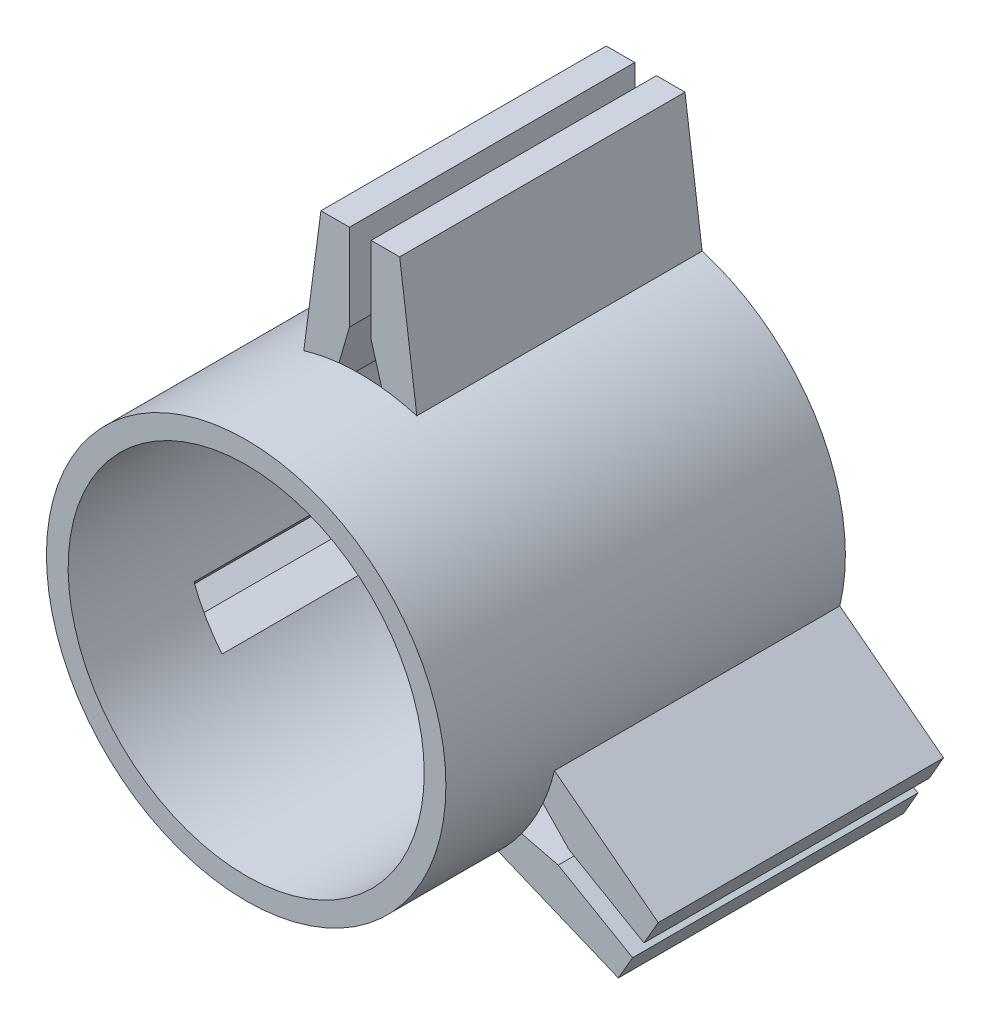
ISO-10303-21;
HEADER;
FILE_DESCRIPTION(('STEP AP214'),'2;1');
FILE_NAME('part.step','',(''),(''),'','','');
FILE_SCHEMA(('AUTOMOTIVE_DESIGN { 1 0 10303 214 1 1 1 1 }'));
ENDSEC;
DATA;
#1=APPLICATION_CONTEXT('core data for automotive mechanical design processes');
#2=APPLICATION_PROTOCOL_DEFINITION('international standard','automotive_design',2000,#1);
#3=PRODUCT_CONTEXT('',#1,'mechanical');
#4=PRODUCT('Part','Part','',(#3));
#5=PRODUCT_RELATED_PRODUCT_CATEGORY('part','',(#4));
#6=PRODUCT_DEFINITION_FORMATION('','',#4);
#7=PRODUCT_DEFINITION_CONTEXT('part definition',#1,'design');
#8=PRODUCT_DEFINITION('design','',#6,#7);
#9=PRODUCT_DEFINITION_SHAPE('','',#8);
#10=(LENGTH_UNIT() NAMED_UNIT(*) SI_UNIT(.MILLI.,.METRE.));
#11=(NAMED_UNIT(*) PLANE_ANGLE_UNIT() SI_UNIT($,.RADIAN.));
#12=(NAMED_UNIT(*) SI_UNIT($,.STERADIAN.) SOLID_ANGLE_UNIT());
#13=UNCERTAINTY_MEASURE_WITH_UNIT(LENGTH_MEASURE(1.E-05),#10,'distance_accuracy_value','');
#14=(GEOMETRIC_REPRESENTATION_CONTEXT(3) GLOBAL_UNCERTAINTY_ASSIGNED_CONTEXT((#13)) GLOBAL_UNIT_ASSIGNED_CONTEXT((#10,
#11,#12)) REPRESENTATION_CONTEXT('',''));
#15=CARTESIAN_POINT('',(0.,0.,0.));
#16=DIRECTION('',(0.,0.,1.));
#17=DIRECTION('',(1.,0.,0.));
#18=AXIS2_PLACEMENT_3D('',#15,#16,#17);
#19=CARTESIAN_POINT('',(0.,0.,25.4));
#20=DIRECTION('',(0.,0.,-1.));
#21=DIRECTION('',(-1.,0.,0.));
#22=AXIS2_PLACEMENT_3D('',#19,#20,#21);
#23=CYLINDRICAL_SURFACE('',#22,44.45);
#24=CARTESIAN_POINT('',(0.,0.,25.4));
#25=DIRECTION('',(0.,0.,1.));
#26=DIRECTION('',(1.,0.,0.));
#27=AXIS2_PLACEMENT_3D('',#24,#25,#26);
#28=CIRCLE('',#27,44.45);
#29=CARTESIAN_POINT('',(44.45,0.,25.4));
#30=VERTEX_POINT('',#29);
#31=EDGE_CURVE('E49',#30,#30,#28,.T.);
#32=ORIENTED_EDGE('',*,*,#31,.F.);
#33=EDGE_LOOP('',(#32));
#34=FACE_BOUND('',#33,.T.);
#35=CARTESIAN_POINT('',(0.,0.,-63.5));
#36=DIRECTION('',(0.,0.,-1.));
#37=DIRECTION('',(-1.,0.,0.));
#38=AXIS2_PLACEMENT_3D('',#35,#36,#37);
#39=CIRCLE('',#38,44.45);
#40=CARTESIAN_POINT('',(-43.2092792595573,-10.4288391429532,-63.5));
#41=VERTEX_POINT('',#40);
#42=CARTESIAN_POINT('',(-12.5730000000002,42.6347530894691,-63.5));
#43=VERTEX_POINT('',#42);
#44=EDGE_CURVE('E276',#41,#43,#39,.T.);
#45=ORIENTED_EDGE('',*,*,#44,.F.);
#46=DIRECTION('',(0.,0.,-1.));
#47=VECTOR('',#46,1.);
#48=CARTESIAN_POINT('',(-43.2092792595573,-10.4288391429532,0.));
#49=LINE('',#48,#47);
#50=CARTESIAN_POINT('',(-43.2092792595573,-10.4288391429532,0.));
#51=VERTEX_POINT('',#50);
#52=EDGE_CURVE('E262',#51,#41,#49,.T.);
#53=ORIENTED_EDGE('',*,*,#52,.F.);
#54=CARTESIAN_POINT('',(0.,0.,0.));
#55=DIRECTION('',(0.,0.,1.));
#56=DIRECTION('',(1.,0.,0.));
#57=AXIS2_PLACEMENT_3D('',#54,#55,#56);
#58=CIRCLE('',#57,44.45);
#59=CARTESIAN_POINT('',(-40.650438605974,-17.9817780306048,0.));
#60=VERTEX_POINT('',#59);
#61=EDGE_CURVE('E318',#51,#60,#58,.T.);
#62=ORIENTED_EDGE('',*,*,#61,.T.);
#63=CARTESIAN_POINT('',(-35.8978958827037,-26.2134234924507,0.));
#64=VERTEX_POINT('',#63);
#65=EDGE_CURVE('E324',#60,#64,#58,.T.);
#66=ORIENTED_EDGE('',*,*,#65,.T.);
#67=CARTESIAN_POINT('',(-30.6362792595571,-32.2059139465166,0.));
#68=VERTEX_POINT('',#67);
#69=EDGE_CURVE('E319',#64,#68,#58,.T.);
#70=ORIENTED_EDGE('',*,*,#69,.T.);
#71=DIRECTION('',(0.,0.,-1.));
#72=VECTOR('',#71,1.);
#73=CARTESIAN_POINT('',(-30.6362792595571,-32.2059139465166,0.));
#74=LINE('',#73,#72);
#75=CARTESIAN_POINT('',(-30.6362792595571,-32.2059139465166,-63.5));
#76=VERTEX_POINT('',#75);
#77=EDGE_CURVE('E264',#68,#76,#74,.T.);
#78=ORIENTED_EDGE('',*,*,#77,.T.);
#79=CARTESIAN_POINT('',(30.6362792595574,-32.2059139465163,-63.5));
#80=VERTEX_POINT('',#79);
#81=EDGE_CURVE('E371',#80,#76,#39,.T.);
#82=ORIENTED_EDGE('',*,*,#81,.F.);
#83=DIRECTION('',(0.,0.,-1.));
#84=VECTOR('',#83,1.);
#85=CARTESIAN_POINT('',(30.6362792595574,-32.2059139465163,0.));
#86=LINE('',#85,#84);
#87=CARTESIAN_POINT('',(30.6362792595574,-32.2059139465163,0.));
#88=VERTEX_POINT('',#87);
#89=EDGE_CURVE('E557',#88,#80,#86,.T.);
#90=ORIENTED_EDGE('',*,*,#89,.F.);
#91=CARTESIAN_POINT('',(35.8978958827036,-26.2134234924507,0.));
#92=VERTEX_POINT('',#91);
#93=EDGE_CURVE('E325',#88,#92,#58,.T.);
#94=ORIENTED_EDGE('',*,*,#93,.T.);
#95=CARTESIAN_POINT('',(40.6504386059739,-17.9817780306048,0.));
#96=VERTEX_POINT('',#95);
#97=EDGE_CURVE('E331',#92,#96,#58,.T.);
#98=ORIENTED_EDGE('',*,*,#97,.T.);
#99=CARTESIAN_POINT('',(43.2092792595574,-10.4288391429528,0.));
#100=VERTEX_POINT('',#99);
#101=EDGE_CURVE('E312',#96,#100,#58,.T.);
#102=ORIENTED_EDGE('',*,*,#101,.T.);
#103=DIRECTION('',(0.,0.,-1.));
#104=VECTOR('',#103,1.);
#105=CARTESIAN_POINT('',(43.2092792595574,-10.4288391429528,0.));
#106=LINE('',#105,#104);
#107=CARTESIAN_POINT('',(43.2092792595574,-10.4288391429528,-63.5));
#108=VERTEX_POINT('',#107);
#109=EDGE_CURVE('E501',#100,#108,#106,.T.);
#110=ORIENTED_EDGE('',*,*,#109,.T.);
#111=CARTESIAN_POINT('',(12.5729999999998,42.6347530894692,-63.5));
#112=VERTEX_POINT('',#111);
#113=EDGE_CURVE('E367',#112,#108,#39,.T.);
#114=ORIENTED_EDGE('',*,*,#113,.F.);
#115=DIRECTION('',(0.,0.,-1.));
#116=VECTOR('',#115,1.);
#117=CARTESIAN_POINT('',(12.5729999999998,42.6347530894692,0.));
#118=LINE('',#117,#116);
#119=CARTESIAN_POINT('',(12.5729999999998,42.6347530894692,0.));
#120=VERTEX_POINT('',#119);
#121=EDGE_CURVE('E610',#120,#112,#118,.T.);
#122=ORIENTED_EDGE('',*,*,#121,.F.);
#123=CARTESIAN_POINT('',(4.75254272327029,44.1952015230555,0.));
#124=VERTEX_POINT('',#123);
#125=EDGE_CURVE('E64',#120,#124,#58,.T.);
#126=ORIENTED_EDGE('',*,*,#125,.T.);
#127=CARTESIAN_POINT('',(-4.7525427232703,44.1952015230555,0.));
#128=VERTEX_POINT('',#127);
#129=EDGE_CURVE('E314',#124,#128,#58,.T.);
#130=ORIENTED_EDGE('',*,*,#129,.T.);
#131=CARTESIAN_POINT('',(-12.5730000000002,42.6347530894691,0.));
#132=VERTEX_POINT('',#131);
#133=EDGE_CURVE('E315',#128,#132,#58,.T.);
#134=ORIENTED_EDGE('',*,*,#133,.T.);
#135=DIRECTION('',(0.,0.,-1.));
#136=VECTOR('',#135,1.);
#137=CARTESIAN_POINT('',(-12.5730000000002,42.6347530894691,0.));
#138=LINE('',#137,#136);
#139=EDGE_CURVE('E561',#132,#43,#138,.T.);
#140=ORIENTED_EDGE('',*,*,#139,.T.);
#141=EDGE_LOOP('',(#45,#53,#62,#66,#70,#78,#82,#90,#94,#98,#102,#110,#114,#122,#126,#130,#134,#140));
#142=FACE_BOUND('',#141,.T.);
#143=ADVANCED_FACE('F42',(#34,#142),#23,.T.);
#144=CARTESIAN_POINT('',(0.,0.,-63.5));
#145=DIRECTION('',(0.,0.,-1.));
#146=DIRECTION('',(-1.,0.,0.));
#147=AXIS2_PLACEMENT_3D('',#144,#145,#146);
#148=PLANE('',#147);
#149=DIRECTION('',(0.13142147723,-0.99132658358519,0.));
#150=VECTOR('',#149,1.);
#151=CARTESIAN_POINT('',(8.76299999999971,71.3740000000001,-63.5));
#152=LINE('',#151,#150);
#153=CARTESIAN_POINT('',(8.763,71.374,-63.5));
#154=VERTEX_POINT('',#153);
#155=EDGE_CURVE('E615',#154,#112,#152,.T.);
#156=ORIENTED_EDGE('',*,*,#155,.T.);
#157=ORIENTED_EDGE('',*,*,#113,.T.);
#158=DIRECTION('',(0.793152507238292,-0.60902307038536,0.));
#159=VECTOR('',#158,1.);
#160=CARTESIAN_POINT('',(66.3031823959912,-28.161519386637,-63.5));
#161=LINE('',#160,#159);
#162=CARTESIAN_POINT('',(66.3031823959912,-28.161519386637,-63.5));
#163=VERTEX_POINT('',#162);
#164=EDGE_CURVE('E533',#108,#163,#161,.T.);
#165=ORIENTED_EDGE('',*,*,#164,.T.);
#166=DIRECTION('',(0.500000000000001,0.866025403784438,0.));
#167=VECTOR('',#166,1.);
#168=CARTESIAN_POINT('',(61.9216823959911,-35.7505000000001,-63.5));
#169=LINE('',#168,#167);
#170=CARTESIAN_POINT('',(63.1281823959911,-33.6607807006682,-63.5));
#171=VERTEX_POINT('',#170);
#172=EDGE_CURVE('E369',#171,#163,#169,.T.);
#173=ORIENTED_EDGE('',*,*,#172,.F.);
#174=DIRECTION('',(0.866025403784438,-0.500000000000001,0.));
#175=VECTOR('',#174,1.);
#176=CARTESIAN_POINT('',(1.2065,2.08971929933186,-63.5));
#177=LINE('',#176,#175);
#178=CARTESIAN_POINT('',(46.4567248521855,-24.0355101999686,-63.5));
#179=VERTEX_POINT('',#178);
#180=EDGE_CURVE('E373',#179,#171,#177,.T.);
#181=ORIENTED_EDGE('',*,*,#180,.F.);
#182=DIRECTION('',(0.692203152754547,-0.72170270563208,0.));
#183=VECTOR('',#182,1.);
#184=CARTESIAN_POINT('',(46.4567248521855,-24.0355101999686,-63.5));
#185=LINE('',#184,#183);
#186=CARTESIAN_POINT('',(37.001052007219,-14.1768658863332,-63.5));
#187=VERTEX_POINT('',#186);
#188=EDGE_CURVE('E361',#187,#179,#185,.T.);
#189=ORIENTED_EDGE('',*,*,#188,.F.);
#190=CARTESIAN_POINT('',(0.,0.,-63.5));
#191=DIRECTION('',(0.,0.,-1.));
#192=DIRECTION('',(-1.,0.,0.));
#193=AXIS2_PLACEMENT_3D('',#190,#191,#192);
#194=CIRCLE('',#193,39.624);
#195=CARTESIAN_POINT('',(6.223,39.1322839481674,-63.5));
#196=VERTEX_POINT('',#195);
#197=EDGE_CURVE('E398',#187,#196,#194,.F.);
#198=ORIENTED_EDGE('',*,*,#197,.T.);
#199=DIRECTION('',(0.27891130068007,-0.960316867681158,0.));
#200=VECTOR('',#199,1.);
#201=CARTESIAN_POINT('',(2.413,52.2504589986008,-63.5));
#202=LINE('',#201,#200);
#203=CARTESIAN_POINT('',(2.413,52.2504589986008,-63.5));
#204=VERTEX_POINT('',#203);
#205=EDGE_CURVE('E457',#204,#196,#202,.T.);
#206=ORIENTED_EDGE('',*,*,#205,.F.);
#207=DIRECTION('',(0.,1.,0.));
#208=VECTOR('',#207,1.);
#209=CARTESIAN_POINT('',(2.413,0.,-63.5));
#210=LINE('',#209,#208);
#211=CARTESIAN_POINT('',(2.413,71.374,-63.5));
#212=VERTEX_POINT('',#211);
#213=EDGE_CURVE('E391',#204,#212,#210,.T.);
#214=ORIENTED_EDGE('',*,*,#213,.T.);
#215=DIRECTION('',(1.,0.,0.));
#216=VECTOR('',#215,1.);
#217=CARTESIAN_POINT('',(0.,71.374,-63.5));
#218=LINE('',#217,#216);
#219=EDGE_CURVE('E393',#212,#154,#218,.T.);
#220=ORIENTED_EDGE('',*,*,#219,.T.);
#221=EDGE_LOOP('',(#156,#157,#165,#173,#181,#189,#198,#206,#214,#220));
#222=FACE_BOUND('',#221,.T.);
#223=ADVANCED_FACE('F515',(#222),#148,.T.);
#224=ORIENTED_EDGE('',*,*,#81,.T.);
#225=DIRECTION('',(-0.924005704063663,-0.38237868515101,0.));
#226=VECTOR('',#225,1.);
#227=CARTESIAN_POINT('',(-57.5401823959908,-43.3394806133636,-63.5));
#228=LINE('',#227,#226);
#229=CARTESIAN_POINT('',(-57.5401823959908,-43.3394806133636,-63.5));
#230=VERTEX_POINT('',#229);
#231=EDGE_CURVE('E607',#76,#230,#228,.T.);
#232=ORIENTED_EDGE('',*,*,#231,.T.);
#233=DIRECTION('',(0.5,-0.866025403784439,0.));
#234=VECTOR('',#233,1.);
#235=CARTESIAN_POINT('',(-61.9216823959912,-35.7505,-63.5));
#236=LINE('',#235,#234);
#237=CARTESIAN_POINT('',(-60.7151823959912,-37.8402192993318,-63.5));
#238=VERTEX_POINT('',#237);
#239=EDGE_CURVE('E380',#238,#230,#236,.T.);
#240=ORIENTED_EDGE('',*,*,#239,.F.);
#241=DIRECTION('',(-0.866025403784439,-0.5,0.));
#242=VECTOR('',#241,1.);
#243=CARTESIAN_POINT('',(1.2065,-2.08971929933186,-63.5));
#244=LINE('',#243,#242);
#245=CARTESIAN_POINT('',(-44.0437248521855,-28.2149487986322,-63.5));
#246=VERTEX_POINT('',#245);
#247=EDGE_CURVE('E383',#246,#238,#244,.T.);
#248=ORIENTED_EDGE('',*,*,#247,.F.);
#249=DIRECTION('',(-0.971114453434618,-0.238614162049078,0.));
#250=VECTOR('',#249,1.);
#251=CARTESIAN_POINT('',(-44.0437248521855,-28.2149487986322,-63.5));
#252=LINE('',#251,#250);
#253=CARTESIAN_POINT('',(-30.778052007219,-24.9554180618343,-63.5));
#254=VERTEX_POINT('',#253);
#255=EDGE_CURVE('E481',#254,#246,#252,.T.);
#256=ORIENTED_EDGE('',*,*,#255,.F.);
#257=CARTESIAN_POINT('',(30.778052007219,-24.9554180618343,-63.5));
#258=VERTEX_POINT('',#257);
#259=EDGE_CURVE('E399',#254,#258,#194,.F.);
#260=ORIENTED_EDGE('',*,*,#259,.T.);
#261=DIRECTION('',(-0.971114453434618,0.238614162049079,0.));
#262=VECTOR('',#261,1.);
#263=CARTESIAN_POINT('',(44.0437248521855,-28.2149487986323,-63.5));
#264=LINE('',#263,#262);
#265=CARTESIAN_POINT('',(44.0437248521855,-28.2149487986323,-63.5));
#266=VERTEX_POINT('',#265);
#267=EDGE_CURVE('E362',#266,#258,#264,.T.);
#268=ORIENTED_EDGE('',*,*,#267,.F.);
#269=DIRECTION('',(0.866025403784438,-0.5,0.));
#270=VECTOR('',#269,1.);
#271=CARTESIAN_POINT('',(-1.2065,-2.08971929933185,-63.5));
#272=LINE('',#271,#270);
#273=CARTESIAN_POINT('',(60.6051971697105,-37.7767192993319,-63.5));
#274=VERTEX_POINT('',#273);
#275=EDGE_CURVE('E375',#266,#274,#272,.T.);
#276=ORIENTED_EDGE('',*,*,#275,.T.);
#277=DIRECTION('',(-0.5,-0.866025403784438,0.));
#278=VECTOR('',#277,1.);
#279=CARTESIAN_POINT('',(61.8116971697105,-35.687,-63.5));
#280=LINE('',#279,#278);
#281=CARTESIAN_POINT('',(57.4301971697105,-43.2759806133631,-63.5));
#282=VERTEX_POINT('',#281);
#283=EDGE_CURVE('E377',#274,#282,#280,.T.);
#284=ORIENTED_EDGE('',*,*,#283,.T.);
#285=DIRECTION('',(-0.924224743446611,0.381848953908541,0.));
#286=VECTOR('',#285,1.);
#287=CARTESIAN_POINT('',(57.4301971697105,-43.2759806133631,-63.5));
#288=LINE('',#287,#286);
#289=EDGE_CURVE('E536',#282,#80,#288,.T.);
#290=ORIENTED_EDGE('',*,*,#289,.T.);
#291=EDGE_LOOP('',(#224,#232,#240,#248,#256,#260,#268,#276,#284,#290));
#292=FACE_BOUND('',#291,.T.);
#293=ADVANCED_FACE('F581',(#292),#148,.T.);
#294=CARTESIAN_POINT('',(0.,0.,25.4));
#295=DIRECTION('',(0.,0.,1.));
#296=DIRECTION('',(1.,0.,0.));
#297=AXIS2_PLACEMENT_3D('',#294,#295,#296);
#298=PLANE('',#297);
#299=ORIENTED_EDGE('',*,*,#31,.T.);
#300=EDGE_LOOP('',(#299));
#301=FACE_BOUND('',#300,.T.);
#302=CARTESIAN_POINT('',(0.,0.,25.4));
#303=DIRECTION('',(0.,0.,1.));
#304=DIRECTION('',(1.,0.,0.));
#305=AXIS2_PLACEMENT_3D('',#302,#303,#304);
#306=CIRCLE('',#305,39.624);
#307=CARTESIAN_POINT('',(39.624,0.,25.4));
#308=VERTEX_POINT('',#307);
#309=EDGE_CURVE('E309',#308,#308,#306,.T.);
#310=ORIENTED_EDGE('',*,*,#309,.F.);
#311=EDGE_LOOP('',(#310));
#312=FACE_BOUND('',#311,.T.);
#313=ADVANCED_FACE('F651',(#301,#312),#298,.T.);
#314=CARTESIAN_POINT('',(0.,0.,25.4));
#315=DIRECTION('',(0.,0.,-1.));
#316=DIRECTION('',(-1.,0.,0.));
#317=AXIS2_PLACEMENT_3D('',#314,#315,#316);
#318=CYLINDRICAL_SURFACE('',#317,39.624);
#319=DIRECTION('',(0.,0.,-1.));
#320=VECTOR('',#319,1.);
#321=CARTESIAN_POINT('',(6.223,39.1322839481674,0.));
#322=LINE('',#321,#320);
#323=CARTESIAN_POINT('',(6.223,39.1322839481674,0.));
#324=VERTEX_POINT('',#323);
#325=EDGE_CURVE('E451',#324,#196,#322,.T.);
#326=ORIENTED_EDGE('',*,*,#325,.T.);
#327=ORIENTED_EDGE('',*,*,#197,.F.);
#328=DIRECTION('',(0.,0.,-1.));
#329=VECTOR('',#328,1.);
#330=CARTESIAN_POINT('',(37.001052007219,-14.1768658863332,0.));
#331=LINE('',#330,#329);
#332=CARTESIAN_POINT('',(37.001052007219,-14.1768658863332,0.));
#333=VERTEX_POINT('',#332);
#334=EDGE_CURVE('E497',#333,#187,#331,.T.);
#335=ORIENTED_EDGE('',*,*,#334,.F.);
#336=CARTESIAN_POINT('',(0.,0.,0.));
#337=DIRECTION('',(0.,0.,1.));
#338=DIRECTION('',(-1.,0.,0.));
#339=AXIS2_PLACEMENT_3D('',#336,#337,#338);
#340=CIRCLE('',#339,39.624);
#341=CARTESIAN_POINT('',(30.778052007219,-24.9554180618343,0.));
#342=VERTEX_POINT('',#341);
#343=EDGE_CURVE('E353',#342,#333,#340,.T.);
#344=ORIENTED_EDGE('',*,*,#343,.F.);
#345=DIRECTION('',(0.,0.,-1.));
#346=VECTOR('',#345,1.);
#347=CARTESIAN_POINT('',(30.778052007219,-24.9554180618343,0.));
#348=LINE('',#347,#346);
#349=EDGE_CURVE('E351',#342,#258,#348,.T.);
#350=ORIENTED_EDGE('',*,*,#349,.T.);
#351=ORIENTED_EDGE('',*,*,#259,.F.);
#352=DIRECTION('',(0.,0.,-1.));
#353=VECTOR('',#352,1.);
#354=CARTESIAN_POINT('',(-30.778052007219,-24.9554180618343,0.));
#355=LINE('',#354,#353);
#356=CARTESIAN_POINT('',(-30.778052007219,-24.9554180618343,0.));
#357=VERTEX_POINT('',#356);
#358=EDGE_CURVE('E476',#357,#254,#355,.T.);
#359=ORIENTED_EDGE('',*,*,#358,.F.);
#360=CARTESIAN_POINT('',(0.,0.,0.));
#361=DIRECTION('',(0.,0.,1.));
#362=DIRECTION('',(-1.,0.,0.));
#363=AXIS2_PLACEMENT_3D('',#360,#361,#362);
#364=CIRCLE('',#363,39.624);
#365=CARTESIAN_POINT('',(-37.001052007219,-14.1768658863331,0.));
#366=VERTEX_POINT('',#365);
#367=EDGE_CURVE('E488',#366,#357,#364,.T.);
#368=ORIENTED_EDGE('',*,*,#367,.F.);
#369=DIRECTION('',(0.,0.,-1.));
#370=VECTOR('',#369,1.);
#371=CARTESIAN_POINT('',(-37.001052007219,-14.1768658863331,0.));
#372=LINE('',#371,#370);
#373=CARTESIAN_POINT('',(-37.001052007219,-14.1768658863331,-63.5));
#374=VERTEX_POINT('',#373);
#375=EDGE_CURVE('E473',#366,#374,#372,.T.);
#376=ORIENTED_EDGE('',*,*,#375,.T.);
#377=CARTESIAN_POINT('',(-6.223,39.1322839481674,-63.5));
#378=VERTEX_POINT('',#377);
#379=EDGE_CURVE('E395',#378,#374,#194,.F.);
#380=ORIENTED_EDGE('',*,*,#379,.F.);
#381=DIRECTION('',(0.,0.,-1.));
#382=VECTOR('',#381,1.);
#383=CARTESIAN_POINT('',(-6.223,39.1322839481674,0.));
#384=LINE('',#383,#382);
#385=CARTESIAN_POINT('',(-6.223,39.1322839481674,0.));
#386=VERTEX_POINT('',#385);
#387=EDGE_CURVE('E466',#386,#378,#384,.T.);
#388=ORIENTED_EDGE('',*,*,#387,.F.);
#389=CARTESIAN_POINT('',(0.,0.,0.));
#390=DIRECTION('',(0.,0.,1.));
#391=DIRECTION('',(-1.,0.,0.));
#392=AXIS2_PLACEMENT_3D('',#389,#390,#391);
#393=CIRCLE('',#392,39.624);
#394=EDGE_CURVE('E449',#324,#386,#393,.T.);
#395=ORIENTED_EDGE('',*,*,#394,.F.);
#396=EDGE_LOOP('',(#326,#327,#335,#344,#350,#351,#359,#368,#376,#380,#388,#395));
#397=FACE_BOUND('',#396,.T.);
#398=ORIENTED_EDGE('',*,*,#309,.T.);
#399=EDGE_LOOP('',(#398));
#400=FACE_BOUND('',#399,.T.);
#401=ADVANCED_FACE('F506',(#397,#400),#318,.F.);
#402=CARTESIAN_POINT('',(0.,0.,0.));
#403=DIRECTION('',(0.,0.,-1.));
#404=DIRECTION('',(-1.,0.,0.));
#405=AXIS2_PLACEMENT_3D('',#402,#403,#404);
#406=PLANE('',#405);
#407=DIRECTION('',(0.,1.,0.));
#408=VECTOR('',#407,1.);
#409=CARTESIAN_POINT('',(2.413,0.,0.));
#410=LINE('',#409,#408);
#411=CARTESIAN_POINT('',(2.413,52.2504589986008,0.));
#412=VERTEX_POINT('',#411);
#413=CARTESIAN_POINT('',(2.413,71.374,0.));
#414=VERTEX_POINT('',#413);
#415=EDGE_CURVE('E421',#412,#414,#410,.T.);
#416=ORIENTED_EDGE('',*,*,#415,.F.);
#417=DIRECTION('',(0.27891130068007,-0.960316867681158,0.));
#418=VECTOR('',#417,1.);
#419=CARTESIAN_POINT('',(2.413,52.2504589986008,0.));
#420=LINE('',#419,#418);
#421=EDGE_CURVE('E453',#412,#124,#420,.T.);
#422=ORIENTED_EDGE('',*,*,#421,.T.);
#423=ORIENTED_EDGE('',*,*,#125,.F.);
#424=DIRECTION('',(0.13142147723,-0.99132658358519,0.));
#425=VECTOR('',#424,1.);
#426=CARTESIAN_POINT('',(8.76299999999971,71.3740000000001,0.));
#427=LINE('',#426,#425);
#428=CARTESIAN_POINT('',(8.76299999999971,71.3740000000001,0.));
#429=VERTEX_POINT('',#428);
#430=EDGE_CURVE('E614',#429,#120,#427,.T.);
#431=ORIENTED_EDGE('',*,*,#430,.F.);
#432=DIRECTION('',(1.,0.,0.));
#433=VECTOR('',#432,1.);
#434=CARTESIAN_POINT('',(0.,71.374,0.));
#435=LINE('',#434,#433);
#436=EDGE_CURVE('E370',#414,#429,#435,.T.);
#437=ORIENTED_EDGE('',*,*,#436,.F.);
#438=EDGE_LOOP('',(#416,#422,#423,#431,#437));
#439=FACE_BOUND('',#438,.T.);
#440=ADVANCED_FACE('F622',(#439),#406,.F.);
#441=ORIENTED_EDGE('',*,*,#133,.F.);
#442=DIRECTION('',(0.27891130068007,0.960316867681158,0.));
#443=VECTOR('',#442,1.);
#444=CARTESIAN_POINT('',(-2.413,52.2504589986008,0.));
#445=LINE('',#444,#443);
#446=CARTESIAN_POINT('',(-2.413,52.2504589986008,0.));
#447=VERTEX_POINT('',#446);
#448=EDGE_CURVE('E445',#128,#447,#445,.T.);
#449=ORIENTED_EDGE('',*,*,#448,.T.);
#450=DIRECTION('',(0.,1.,0.));
#451=VECTOR('',#450,1.);
#452=CARTESIAN_POINT('',(-2.413,0.,0.));
#453=LINE('',#452,#451);
#454=CARTESIAN_POINT('',(-2.413,71.501,0.));
#455=VERTEX_POINT('',#454);
#456=EDGE_CURVE('E419',#447,#455,#453,.T.);
#457=ORIENTED_EDGE('',*,*,#456,.T.);
#458=DIRECTION('',(-1.,0.,0.));
#459=VECTOR('',#458,1.);
#460=CARTESIAN_POINT('',(0.,71.501,0.));
#461=LINE('',#460,#459);
#462=CARTESIAN_POINT('',(-8.76300000000031,71.501,0.));
#463=VERTEX_POINT('',#462);
#464=EDGE_CURVE('E416',#455,#463,#461,.T.);
#465=ORIENTED_EDGE('',*,*,#464,.T.);
#466=DIRECTION('',(0.13085319682537,0.991401755536362,0.));
#467=VECTOR('',#466,1.);
#468=CARTESIAN_POINT('',(-8.76300000000031,71.501,0.));
#469=LINE('',#468,#467);
#470=EDGE_CURVE('E443',#132,#463,#469,.T.);
#471=ORIENTED_EDGE('',*,*,#470,.F.);
#472=EDGE_LOOP('',(#441,#449,#457,#465,#471));
#473=FACE_BOUND('',#472,.T.);
#474=ADVANCED_FACE('F442',(#473),#406,.F.);
#475=DIRECTION('',(-0.866025403784439,-0.5,0.));
#476=VECTOR('',#475,1.);
#477=CARTESIAN_POINT('',(-1.2065,2.08971929933185,0.));
#478=LINE('',#477,#476);
#479=CARTESIAN_POINT('',(-46.4567248521855,-24.0355101999685,0.));
#480=VERTEX_POINT('',#479);
#481=CARTESIAN_POINT('',(-63.0181971697105,-33.5972807006681,0.));
#482=VERTEX_POINT('',#481);
#483=EDGE_CURVE('E413',#480,#482,#478,.T.);
#484=ORIENTED_EDGE('',*,*,#483,.F.);
#485=DIRECTION('',(0.692203152754548,0.72170270563208,0.));
#486=VECTOR('',#485,1.);
#487=CARTESIAN_POINT('',(-46.4567248521855,-24.0355101999685,0.));
#488=LINE('',#487,#486);
#489=EDGE_CURVE('E483',#480,#60,#488,.T.);
#490=ORIENTED_EDGE('',*,*,#489,.T.);
#491=ORIENTED_EDGE('',*,*,#61,.F.);
#492=DIRECTION('',(0.792803266216609,0.609477629676657,0.));
#493=VECTOR('',#492,1.);
#494=CARTESIAN_POINT('',(-66.1931971697103,-28.0980193866375,0.));
#495=LINE('',#494,#493);
#496=CARTESIAN_POINT('',(-66.1931971697103,-28.0980193866375,0.));
#497=VERTEX_POINT('',#496);
#498=EDGE_CURVE('E265',#497,#51,#495,.T.);
#499=ORIENTED_EDGE('',*,*,#498,.F.);
#500=DIRECTION('',(-0.5,0.866025403784439,0.));
#501=VECTOR('',#500,1.);
#502=CARTESIAN_POINT('',(-61.8116971697105,-35.687,0.));
#503=LINE('',#502,#501);
#504=EDGE_CURVE('E281',#482,#497,#503,.T.);
#505=ORIENTED_EDGE('',*,*,#504,.F.);
#506=EDGE_LOOP('',(#484,#490,#491,#499,#505));
#507=FACE_BOUND('',#506,.T.);
#508=ADVANCED_FACE('F601',(#507),#406,.F.);
#509=ORIENTED_EDGE('',*,*,#69,.F.);
#510=DIRECTION('',(-0.971114453434618,-0.238614162049078,0.));
#511=VECTOR('',#510,1.);
#512=CARTESIAN_POINT('',(-44.0437248521855,-28.2149487986322,0.));
#513=LINE('',#512,#511);
#514=CARTESIAN_POINT('',(-44.0437248521855,-28.2149487986322,0.));
#515=VERTEX_POINT('',#514);
#516=EDGE_CURVE('E472',#64,#515,#513,.T.);
#517=ORIENTED_EDGE('',*,*,#516,.T.);
#518=DIRECTION('',(-0.866025403784439,-0.5,0.));
#519=VECTOR('',#518,1.);
#520=CARTESIAN_POINT('',(1.2065,-2.08971929933186,0.));
#521=LINE('',#520,#519);
#522=CARTESIAN_POINT('',(-60.7151823959912,-37.8402192993318,0.));
#523=VERTEX_POINT('',#522);
#524=EDGE_CURVE('E411',#515,#523,#521,.T.);
#525=ORIENTED_EDGE('',*,*,#524,.T.);
#526=DIRECTION('',(0.5,-0.866025403784439,0.));
#527=VECTOR('',#526,1.);
#528=CARTESIAN_POINT('',(-61.9216823959912,-35.7505,0.));
#529=LINE('',#528,#527);
#530=CARTESIAN_POINT('',(-57.5401823959912,-43.339480613363,0.));
#531=VERTEX_POINT('',#530);
#532=EDGE_CURVE('E408',#523,#531,#529,.T.);
#533=ORIENTED_EDGE('',*,*,#532,.T.);
#534=DIRECTION('',(-0.924005704063663,-0.38237868515101,0.));
#535=VECTOR('',#534,1.);
#536=CARTESIAN_POINT('',(-57.5401823959908,-43.3394806133636,0.));
#537=LINE('',#536,#535);
#538=EDGE_CURVE('E606',#68,#531,#537,.T.);
#539=ORIENTED_EDGE('',*,*,#538,.F.);
#540=EDGE_LOOP('',(#509,#517,#525,#533,#539));
#541=FACE_BOUND('',#540,.T.);
#542=ADVANCED_FACE('F764',(#541),#406,.F.);
#543=DIRECTION('',(0.866025403784438,-0.5,0.));
#544=VECTOR('',#543,1.);
#545=CARTESIAN_POINT('',(-1.2065,-2.08971929933185,0.));
#546=LINE('',#545,#544);
#547=CARTESIAN_POINT('',(44.0437248521855,-28.2149487986323,0.));
#548=VERTEX_POINT('',#547);
#549=CARTESIAN_POINT('',(60.6051971697105,-37.7767192993319,0.));
#550=VERTEX_POINT('',#549);
#551=EDGE_CURVE('E360',#548,#550,#546,.T.);
#552=ORIENTED_EDGE('',*,*,#551,.F.);
#553=DIRECTION('',(-0.971114453434618,0.238614162049079,0.));
#554=VECTOR('',#553,1.);
#555=CARTESIAN_POINT('',(44.0437248521855,-28.2149487986323,0.));
#556=LINE('',#555,#554);
#557=EDGE_CURVE('E348',#548,#92,#556,.T.);
#558=ORIENTED_EDGE('',*,*,#557,.T.);
#559=ORIENTED_EDGE('',*,*,#93,.F.);
#560=DIRECTION('',(-0.924224743446611,0.381848953908541,0.));
#561=VECTOR('',#560,1.);
#562=CARTESIAN_POINT('',(57.4301971697105,-43.2759806133631,0.));
#563=LINE('',#562,#561);
#564=CARTESIAN_POINT('',(57.4301971697105,-43.2759806133631,0.));
#565=VERTEX_POINT('',#564);
#566=EDGE_CURVE('E539',#565,#88,#563,.T.);
#567=ORIENTED_EDGE('',*,*,#566,.F.);
#568=DIRECTION('',(-0.5,-0.866025403784438,0.));
#569=VECTOR('',#568,1.);
#570=CARTESIAN_POINT('',(61.8116971697105,-35.687,0.));
#571=LINE('',#570,#569);
#572=EDGE_CURVE('E406',#550,#565,#571,.T.);
#573=ORIENTED_EDGE('',*,*,#572,.F.);
#574=EDGE_LOOP('',(#552,#558,#559,#567,#573));
#575=FACE_BOUND('',#574,.T.);
#576=ADVANCED_FACE('F357',(#575),#406,.F.);
#577=CARTESIAN_POINT('',(61.9216823959911,-35.7505000000001,-63.5));
#578=DIRECTION('',(0.866025403784438,-0.500000000000001,0.));
#579=DIRECTION('',(0.500000000000001,0.866025403784438,0.));
#580=AXIS2_PLACEMENT_3D('',#577,#578,#579);
#581=PLANE('',#580);
#582=DIRECTION('',(0.500000000000001,0.866025403784438,0.));
#583=VECTOR('',#582,1.);
#584=CARTESIAN_POINT('',(61.9216823959911,-35.7505000000001,0.));
#585=LINE('',#584,#583);
#586=CARTESIAN_POINT('',(63.1281823959911,-33.6607807006682,0.));
#587=VERTEX_POINT('',#586);
#588=CARTESIAN_POINT('',(66.3031823959912,-28.161519386637,0.));
#589=VERTEX_POINT('',#588);
#590=EDGE_CURVE('E400',#587,#589,#585,.T.);
#591=ORIENTED_EDGE('',*,*,#590,.F.);
#592=DIRECTION('',(0.,0.,1.));
#593=VECTOR('',#592,1.);
#594=CARTESIAN_POINT('',(63.1281823959911,-33.6607807006682,-63.5));
#595=LINE('',#594,#593);
#596=EDGE_CURVE('E303',#171,#587,#595,.T.);
#597=ORIENTED_EDGE('',*,*,#596,.F.);
#598=ORIENTED_EDGE('',*,*,#172,.T.);
#599=DIRECTION('',(0.,0.,1.));
#600=VECTOR('',#599,1.);
#601=CARTESIAN_POINT('',(66.3031823959912,-28.161519386637,-63.5));
#602=LINE('',#601,#600);
#603=EDGE_CURVE('E306',#163,#589,#602,.T.);
#604=ORIENTED_EDGE('',*,*,#603,.T.);
#605=EDGE_LOOP('',(#591,#597,#598,#604));
#606=FACE_BOUND('',#605,.T.);
#607=ADVANCED_FACE('F525',(#606),#581,.T.);
#608=CARTESIAN_POINT('',(1.2065,2.08971929933186,-63.5));
#609=DIRECTION('',(-0.500000000000001,-0.866025403784438,0.));
#610=DIRECTION('',(0.866025403784438,-0.500000000000001,0.));
#611=AXIS2_PLACEMENT_3D('',#608,#609,#610);
#612=PLANE('',#611);
#613=DIRECTION('',(0.,0.,-1.));
#614=VECTOR('',#613,1.);
#615=CARTESIAN_POINT('',(46.4567248521855,-24.0355101999686,0.));
#616=LINE('',#615,#614);
#617=CARTESIAN_POINT('',(46.4567248521854,-24.0355101999685,0.));
#618=VERTEX_POINT('',#617);
#619=EDGE_CURVE('E499',#618,#179,#616,.T.);
#620=ORIENTED_EDGE('',*,*,#619,.T.);
#621=ORIENTED_EDGE('',*,*,#180,.T.);
#622=ORIENTED_EDGE('',*,*,#596,.T.);
#623=DIRECTION('',(0.866025403784438,-0.500000000000001,0.));
#624=VECTOR('',#623,1.);
#625=CARTESIAN_POINT('',(1.2065,2.08971929933186,0.));
#626=LINE('',#625,#624);
#627=EDGE_CURVE('E402',#618,#587,#626,.T.);
#628=ORIENTED_EDGE('',*,*,#627,.F.);
#629=EDGE_LOOP('',(#620,#621,#622,#628));
#630=FACE_BOUND('',#629,.T.);
#631=ADVANCED_FACE('F521',(#630),#612,.T.);
#632=CARTESIAN_POINT('',(-1.2065,-2.08971929933185,-63.5));
#633=DIRECTION('',(-0.5,-0.866025403784438,0.));
#634=DIRECTION('',(0.866025403784438,-0.5,0.));
#635=AXIS2_PLACEMENT_3D('',#632,#633,#634);
#636=PLANE('',#635);
#637=ORIENTED_EDGE('',*,*,#275,.F.);
#638=DIRECTION('',(0.,0.,-1.));
#639=VECTOR('',#638,1.);
#640=CARTESIAN_POINT('',(44.0437248521855,-28.2149487986323,0.));
#641=LINE('',#640,#639);
#642=EDGE_CURVE('E494',#548,#266,#641,.T.);
#643=ORIENTED_EDGE('',*,*,#642,.F.);
#644=ORIENTED_EDGE('',*,*,#551,.T.);
#645=DIRECTION('',(0.,0.,1.));
#646=VECTOR('',#645,1.);
#647=CARTESIAN_POINT('',(60.6051971697105,-37.7767192993319,-63.5));
#648=LINE('',#647,#646);
#649=EDGE_CURVE('E300',#274,#550,#648,.T.);
#650=ORIENTED_EDGE('',*,*,#649,.F.);
#651=EDGE_LOOP('',(#637,#643,#644,#650));
#652=FACE_BOUND('',#651,.T.);
#653=ADVANCED_FACE('F578',(#652),#636,.F.);
#654=CARTESIAN_POINT('',(61.8116971697105,-35.687,-63.5));
#655=DIRECTION('',(-0.866025403784438,0.5,0.));
#656=DIRECTION('',(-0.5,-0.866025403784438,0.));
#657=AXIS2_PLACEMENT_3D('',#654,#655,#656);
#658=PLANE('',#657);
#659=ORIENTED_EDGE('',*,*,#572,.T.);
#660=DIRECTION('',(0.,0.,1.));
#661=VECTOR('',#660,1.);
#662=CARTESIAN_POINT('',(57.4301971697105,-43.2759806133631,-63.5));
#663=LINE('',#662,#661);
#664=EDGE_CURVE('E297',#282,#565,#663,.T.);
#665=ORIENTED_EDGE('',*,*,#664,.F.);
#666=ORIENTED_EDGE('',*,*,#283,.F.);
#667=ORIENTED_EDGE('',*,*,#649,.T.);
#668=EDGE_LOOP('',(#659,#665,#666,#667));
#669=FACE_BOUND('',#668,.T.);
#670=ADVANCED_FACE('F573',(#669),#658,.F.);
#671=CARTESIAN_POINT('',(-61.9216823959912,-35.7505,-63.5));
#672=DIRECTION('',(-0.866025403784439,-0.499999999999999,0.));
#673=DIRECTION('',(0.5,-0.866025403784439,0.));
#674=AXIS2_PLACEMENT_3D('',#671,#672,#673);
#675=PLANE('',#674);
#676=ORIENTED_EDGE('',*,*,#532,.F.);
#677=DIRECTION('',(0.,0.,1.));
#678=VECTOR('',#677,1.);
#679=CARTESIAN_POINT('',(-60.7151823959912,-37.8402192993318,-63.5));
#680=LINE('',#679,#678);
#681=EDGE_CURVE('E285',#238,#523,#680,.T.);
#682=ORIENTED_EDGE('',*,*,#681,.F.);
#683=ORIENTED_EDGE('',*,*,#239,.T.);
#684=DIRECTION('',(0.,0.,1.));
#685=VECTOR('',#684,1.);
#686=CARTESIAN_POINT('',(-57.5401823959912,-43.339480613363,-63.5));
#687=LINE('',#686,#685);
#688=EDGE_CURVE('E294',#230,#531,#687,.T.);
#689=ORIENTED_EDGE('',*,*,#688,.T.);
#690=EDGE_LOOP('',(#676,#682,#683,#689));
#691=FACE_BOUND('',#690,.T.);
#692=ADVANCED_FACE('F670',(#691),#675,.T.);
#693=CARTESIAN_POINT('',(1.2065,-2.08971929933186,-63.5));
#694=DIRECTION('',(-0.5,0.866025403784439,0.));
#695=DIRECTION('',(-0.866025403784439,-0.5,0.));
#696=AXIS2_PLACEMENT_3D('',#693,#694,#695);
#697=PLANE('',#696);
#698=DIRECTION('',(0.,0.,-1.));
#699=VECTOR('',#698,1.);
#700=CARTESIAN_POINT('',(-44.0437248521855,-28.2149487986322,0.));
#701=LINE('',#700,#699);
#702=EDGE_CURVE('E478',#515,#246,#701,.T.);
#703=ORIENTED_EDGE('',*,*,#702,.T.);
#704=ORIENTED_EDGE('',*,*,#247,.T.);
#705=ORIENTED_EDGE('',*,*,#681,.T.);
#706=ORIENTED_EDGE('',*,*,#524,.F.);
#707=EDGE_LOOP('',(#703,#704,#705,#706));
#708=FACE_BOUND('',#707,.T.);
#709=ADVANCED_FACE('F673',(#708),#697,.T.);
#710=CARTESIAN_POINT('',(-1.2065,2.08971929933185,-63.5));
#711=DIRECTION('',(-0.5,0.866025403784439,0.));
#712=DIRECTION('',(-0.866025403784439,-0.5,0.));
#713=AXIS2_PLACEMENT_3D('',#710,#711,#712);
#714=PLANE('',#713);
#715=DIRECTION('',(-0.866025403784439,-0.5,0.));
#716=VECTOR('',#715,1.);
#717=CARTESIAN_POINT('',(-1.2065,2.08971929933185,-63.5));
#718=LINE('',#717,#716);
#719=CARTESIAN_POINT('',(-46.4567248521855,-24.0355101999685,-63.5));
#720=VERTEX_POINT('',#719);
#721=CARTESIAN_POINT('',(-63.0181971697105,-33.5972807006681,-63.5));
#722=VERTEX_POINT('',#721);
#723=EDGE_CURVE('E272',#720,#722,#718,.T.);
#724=ORIENTED_EDGE('',*,*,#723,.F.);
#725=DIRECTION('',(0.,0.,-1.));
#726=VECTOR('',#725,1.);
#727=CARTESIAN_POINT('',(-46.4567248521855,-24.0355101999685,0.));
#728=LINE('',#727,#726);
#729=EDGE_CURVE('E470',#480,#720,#728,.T.);
#730=ORIENTED_EDGE('',*,*,#729,.F.);
#731=ORIENTED_EDGE('',*,*,#483,.T.);
#732=DIRECTION('',(0.,0.,1.));
#733=VECTOR('',#732,1.);
#734=CARTESIAN_POINT('',(-63.0181971697105,-33.5972807006681,-63.5));
#735=LINE('',#734,#733);
#736=EDGE_CURVE('E282',#722,#482,#735,.T.);
#737=ORIENTED_EDGE('',*,*,#736,.F.);
#738=EDGE_LOOP('',(#724,#730,#731,#737));
#739=FACE_BOUND('',#738,.T.);
#740=ADVANCED_FACE('F598',(#739),#714,.F.);
#741=CARTESIAN_POINT('',(-61.8116971697105,-35.687,-63.5));
#742=DIRECTION('',(0.866025403784439,0.499999999999999,0.));
#743=DIRECTION('',(-0.5,0.866025403784439,0.));
#744=AXIS2_PLACEMENT_3D('',#741,#742,#743);
#745=PLANE('',#744);
#746=ORIENTED_EDGE('',*,*,#504,.T.);
#747=DIRECTION('',(0.,0.,1.));
#748=VECTOR('',#747,1.);
#749=CARTESIAN_POINT('',(-66.1931971697105,-28.0980193866369,-63.5));
#750=LINE('',#749,#748);
#751=CARTESIAN_POINT('',(-66.1931971697103,-28.0980193866375,-63.5));
#752=VERTEX_POINT('',#751);
#753=EDGE_CURVE('E259',#752,#497,#750,.T.);
#754=ORIENTED_EDGE('',*,*,#753,.F.);
#755=DIRECTION('',(-0.5,0.866025403784439,0.));
#756=VECTOR('',#755,1.);
#757=CARTESIAN_POINT('',(-61.8116971697105,-35.687,-63.5));
#758=LINE('',#757,#756);
#759=EDGE_CURVE('E268',#722,#752,#758,.T.);
#760=ORIENTED_EDGE('',*,*,#759,.F.);
#761=ORIENTED_EDGE('',*,*,#736,.T.);
#762=EDGE_LOOP('',(#746,#754,#760,#761));
#763=FACE_BOUND('',#762,.T.);
#764=ADVANCED_FACE('F279',(#763),#745,.F.);
#765=CARTESIAN_POINT('',(0.,71.501,-63.5));
#766=DIRECTION('',(0.,1.,0.));
#767=DIRECTION('',(0.,0.,1.));
#768=AXIS2_PLACEMENT_3D('',#765,#766,#767);
#769=PLANE('',#768);
#770=ORIENTED_EDGE('',*,*,#464,.F.);
#771=DIRECTION('',(0.,0.,1.));
#772=VECTOR('',#771,1.);
#773=CARTESIAN_POINT('',(-2.413,71.501,-63.5));
#774=LINE('',#773,#772);
#775=CARTESIAN_POINT('',(-2.413,71.501,-63.5));
#776=VERTEX_POINT('',#775);
#777=EDGE_CURVE('E288',#776,#455,#774,.T.);
#778=ORIENTED_EDGE('',*,*,#777,.F.);
#779=DIRECTION('',(-1.,0.,0.));
#780=VECTOR('',#779,1.);
#781=CARTESIAN_POINT('',(0.,71.501,-63.5));
#782=LINE('',#781,#780);
#783=CARTESIAN_POINT('',(-8.76300000000031,71.501,-63.5));
#784=VERTEX_POINT('',#783);
#785=EDGE_CURVE('E386',#776,#784,#782,.T.);
#786=ORIENTED_EDGE('',*,*,#785,.T.);
#787=DIRECTION('',(0.,0.,1.));
#788=VECTOR('',#787,1.);
#789=CARTESIAN_POINT('',(-8.763,71.501,-63.5));
#790=LINE('',#789,#788);
#791=EDGE_CURVE('E283',#784,#463,#790,.T.);
#792=ORIENTED_EDGE('',*,*,#791,.T.);
#793=EDGE_LOOP('',(#770,#778,#786,#792));
#794=FACE_BOUND('',#793,.T.);
#795=ADVANCED_FACE('F439',(#794),#769,.T.);
#796=CARTESIAN_POINT('',(-2.413,0.,-63.5));
#797=DIRECTION('',(1.,0.,0.));
#798=DIRECTION('',(0.,0.,-1.));
#799=AXIS2_PLACEMENT_3D('',#796,#797,#798);
#800=PLANE('',#799);
#801=DIRECTION('',(0.,0.,-1.));
#802=VECTOR('',#801,1.);
#803=CARTESIAN_POINT('',(-2.413,52.2504589986008,0.));
#804=LINE('',#803,#802);
#805=CARTESIAN_POINT('',(-2.413,52.2504589986008,-63.5));
#806=VERTEX_POINT('',#805);
#807=EDGE_CURVE('E464',#447,#806,#804,.T.);
#808=ORIENTED_EDGE('',*,*,#807,.T.);
#809=DIRECTION('',(0.,1.,0.));
#810=VECTOR('',#809,1.);
#811=CARTESIAN_POINT('',(-2.413,0.,-63.5));
#812=LINE('',#811,#810);
#813=EDGE_CURVE('E389',#806,#776,#812,.T.);
#814=ORIENTED_EDGE('',*,*,#813,.T.);
#815=ORIENTED_EDGE('',*,*,#777,.T.);
#816=ORIENTED_EDGE('',*,*,#456,.F.);
#817=EDGE_LOOP('',(#808,#814,#815,#816));
#818=FACE_BOUND('',#817,.T.);
#819=ADVANCED_FACE('F435',(#818),#800,.T.);
#820=CARTESIAN_POINT('',(2.413,0.,-63.5));
#821=DIRECTION('',(1.,0.,0.));
#822=DIRECTION('',(0.,0.,-1.));
#823=AXIS2_PLACEMENT_3D('',#820,#821,#822);
#824=PLANE('',#823);
#825=ORIENTED_EDGE('',*,*,#213,.F.);
#826=DIRECTION('',(0.,0.,-1.));
#827=VECTOR('',#826,1.);
#828=CARTESIAN_POINT('',(2.413,52.2504589986008,0.));
#829=LINE('',#828,#827);
#830=EDGE_CURVE('E403',#412,#204,#829,.T.);
#831=ORIENTED_EDGE('',*,*,#830,.F.);
#832=ORIENTED_EDGE('',*,*,#415,.T.);
#833=DIRECTION('',(0.,0.,1.));
#834=VECTOR('',#833,1.);
#835=CARTESIAN_POINT('',(2.413,71.374,-63.5));
#836=LINE('',#835,#834);
#837=EDGE_CURVE('E427',#212,#414,#836,.T.);
#838=ORIENTED_EDGE('',*,*,#837,.F.);
#839=EDGE_LOOP('',(#825,#831,#832,#838));
#840=FACE_BOUND('',#839,.T.);
#841=ADVANCED_FACE('F629',(#840),#824,.F.);
#842=CARTESIAN_POINT('',(0.,71.374,-63.5));
#843=DIRECTION('',(0.,-1.,0.));
#844=DIRECTION('',(0.,0.,-1.));
#845=AXIS2_PLACEMENT_3D('',#842,#843,#844);
#846=PLANE('',#845);
#847=ORIENTED_EDGE('',*,*,#436,.T.);
#848=DIRECTION('',(0.,0.,1.));
#849=VECTOR('',#848,1.);
#850=CARTESIAN_POINT('',(8.763,71.374,-63.5));
#851=LINE('',#850,#849);
#852=EDGE_CURVE('E424',#154,#429,#851,.T.);
#853=ORIENTED_EDGE('',*,*,#852,.F.);
#854=ORIENTED_EDGE('',*,*,#219,.F.);
#855=ORIENTED_EDGE('',*,*,#837,.T.);
#856=EDGE_LOOP('',(#847,#853,#854,#855));
#857=FACE_BOUND('',#856,.T.);
#858=ADVANCED_FACE('F624',(#857),#846,.F.);
#859=ORIENTED_EDGE('',*,*,#759,.T.);
#860=DIRECTION('',(0.792803266216609,0.609477629676657,0.));
#861=VECTOR('',#860,1.);
#862=CARTESIAN_POINT('',(-66.1931971697103,-28.0980193866375,-63.5));
#863=LINE('',#862,#861);
#864=EDGE_CURVE('E56',#752,#41,#863,.T.);
#865=ORIENTED_EDGE('',*,*,#864,.T.);
#866=ORIENTED_EDGE('',*,*,#44,.T.);
#867=DIRECTION('',(0.13085319682537,0.991401755536362,0.));
#868=VECTOR('',#867,1.);
#869=CARTESIAN_POINT('',(-8.76300000000031,71.501,-63.5));
#870=LINE('',#869,#868);
#871=EDGE_CURVE('E555',#43,#784,#870,.T.);
#872=ORIENTED_EDGE('',*,*,#871,.T.);
#873=ORIENTED_EDGE('',*,*,#785,.F.);
#874=ORIENTED_EDGE('',*,*,#813,.F.);
#875=DIRECTION('',(0.27891130068007,0.960316867681158,0.));
#876=VECTOR('',#875,1.);
#877=CARTESIAN_POINT('',(-2.413,52.2504589986008,-63.5));
#878=LINE('',#877,#876);
#879=EDGE_CURVE('E459',#378,#806,#878,.T.);
#880=ORIENTED_EDGE('',*,*,#879,.F.);
#881=ORIENTED_EDGE('',*,*,#379,.T.);
#882=DIRECTION('',(0.692203152754548,0.72170270563208,0.));
#883=VECTOR('',#882,1.);
#884=CARTESIAN_POINT('',(-46.4567248521855,-24.0355101999685,-63.5));
#885=LINE('',#884,#883);
#886=EDGE_CURVE('E460',#720,#374,#885,.T.);
#887=ORIENTED_EDGE('',*,*,#886,.F.);
#888=ORIENTED_EDGE('',*,*,#723,.T.);
#889=EDGE_LOOP('',(#859,#865,#866,#872,#873,#874,#880,#881,#887,#888));
#890=FACE_BOUND('',#889,.T.);
#891=ADVANCED_FACE('F269',(#890),#148,.T.);
#892=ORIENTED_EDGE('',*,*,#101,.F.);
#893=DIRECTION('',(0.692203152754547,-0.721702705632081,0.));
#894=VECTOR('',#893,1.);
#895=CARTESIAN_POINT('',(12.1899109483305,11.6916491020239,0.));
#896=LINE('',#895,#894);
#897=EDGE_CURVE('E11',#96,#618,#896,.T.);
#898=ORIENTED_EDGE('',*,*,#897,.T.);
#899=ORIENTED_EDGE('',*,*,#627,.T.);
#900=ORIENTED_EDGE('',*,*,#590,.T.);
#901=DIRECTION('',(0.793152507238292,-0.60902307038536,0.));
#902=VECTOR('',#901,1.);
#903=CARTESIAN_POINT('',(66.3031823959912,-28.161519386637,0.));
#904=LINE('',#903,#902);
#905=EDGE_CURVE('E531',#100,#589,#904,.T.);
#906=ORIENTED_EDGE('',*,*,#905,.F.);
#907=EDGE_LOOP('',(#892,#898,#899,#900,#906));
#908=FACE_BOUND('',#907,.T.);
#909=ADVANCED_FACE('F530',(#908),#406,.F.);
#910=CARTESIAN_POINT('',(0.,0.,0.));
#911=DIRECTION('',(0.,0.,-1.));
#912=DIRECTION('',(-1.,0.,0.));
#913=AXIS2_PLACEMENT_3D('',#910,#911,#912);
#914=PLANE('',#913);
#915=ORIENTED_EDGE('',*,*,#97,.F.);
#916=EDGE_CURVE('E342',#92,#342,#556,.T.);
#917=ORIENTED_EDGE('',*,*,#916,.T.);
#918=ORIENTED_EDGE('',*,*,#343,.T.);
#919=DIRECTION('',(0.692203152754547,-0.72170270563208,0.));
#920=VECTOR('',#919,1.);
#921=CARTESIAN_POINT('',(46.4567248521855,-24.0355101999686,0.));
#922=LINE('',#921,#920);
#923=EDGE_CURVE('E344',#333,#96,#922,.T.);
#924=ORIENTED_EDGE('',*,*,#923,.T.);
#925=EDGE_LOOP('',(#915,#917,#918,#924));
#926=FACE_BOUND('',#925,.T.);
#927=ADVANCED_FACE('F340',(#926),#914,.T.);
#928=CARTESIAN_POINT('',(46.4567248521855,-24.0355101999686,0.));
#929=DIRECTION('',(0.72170270563208,0.692203152754547,0.));
#930=DIRECTION('',(-0.692203152754547,0.721702705632081,0.));
#931=AXIS2_PLACEMENT_3D('',#928,#929,#930);
#932=PLANE('',#931);
#933=ORIENTED_EDGE('',*,*,#188,.T.);
#934=ORIENTED_EDGE('',*,*,#619,.F.);
#935=ORIENTED_EDGE('',*,*,#897,.F.);
#936=ORIENTED_EDGE('',*,*,#923,.F.);
#937=ORIENTED_EDGE('',*,*,#334,.T.);
#938=EDGE_LOOP('',(#933,#934,#935,#936,#937));
#939=FACE_BOUND('',#938,.T.);
#940=ADVANCED_FACE('F511',(#939),#932,.F.);
#941=CARTESIAN_POINT('',(44.0437248521855,-28.2149487986323,0.));
#942=DIRECTION('',(-0.238614162049079,-0.971114453434617,0.));
#943=DIRECTION('',(0.971114453434618,-0.238614162049079,0.));
#944=AXIS2_PLACEMENT_3D('',#941,#942,#943);
#945=PLANE('',#944);
#946=ORIENTED_EDGE('',*,*,#267,.T.);
#947=ORIENTED_EDGE('',*,*,#349,.F.);
#948=ORIENTED_EDGE('',*,*,#916,.F.);
#949=ORIENTED_EDGE('',*,*,#557,.F.);
#950=ORIENTED_EDGE('',*,*,#642,.T.);
#951=EDGE_LOOP('',(#946,#947,#948,#949,#950));
#952=FACE_BOUND('',#951,.T.);
#953=ADVANCED_FACE('F347',(#952),#945,.F.);
#954=CARTESIAN_POINT('',(0.,0.,0.));
#955=DIRECTION('',(0.,0.,-1.));
#956=DIRECTION('',(-1.,0.,0.));
#957=AXIS2_PLACEMENT_3D('',#954,#955,#956);
#958=PLANE('',#957);
#959=ORIENTED_EDGE('',*,*,#65,.F.);
#960=EDGE_CURVE('E491',#60,#366,#488,.T.);
#961=ORIENTED_EDGE('',*,*,#960,.T.);
#962=ORIENTED_EDGE('',*,*,#367,.T.);
#963=EDGE_CURVE('E485',#357,#64,#513,.T.);
#964=ORIENTED_EDGE('',*,*,#963,.T.);
#965=EDGE_LOOP('',(#959,#961,#962,#964));
#966=FACE_BOUND('',#965,.T.);
#967=ADVANCED_FACE('F591',(#966),#958,.T.);
#968=CARTESIAN_POINT('',(-44.0437248521855,-28.2149487986322,0.));
#969=DIRECTION('',(0.238614162049078,-0.971114453434618,0.));
#970=DIRECTION('',(0.971114453434618,0.238614162049078,0.));
#971=AXIS2_PLACEMENT_3D('',#968,#969,#970);
#972=PLANE('',#971);
#973=ORIENTED_EDGE('',*,*,#255,.T.);
#974=ORIENTED_EDGE('',*,*,#702,.F.);
#975=ORIENTED_EDGE('',*,*,#516,.F.);
#976=ORIENTED_EDGE('',*,*,#963,.F.);
#977=ORIENTED_EDGE('',*,*,#358,.T.);
#978=EDGE_LOOP('',(#973,#974,#975,#976,#977));
#979=FACE_BOUND('',#978,.T.);
#980=ADVANCED_FACE('F588',(#979),#972,.F.);
#981=CARTESIAN_POINT('',(-46.4567248521855,-24.0355101999685,0.));
#982=DIRECTION('',(-0.72170270563208,0.692203152754548,0.));
#983=DIRECTION('',(-0.692203152754548,-0.72170270563208,0.));
#984=AXIS2_PLACEMENT_3D('',#981,#982,#983);
#985=PLANE('',#984);
#986=ORIENTED_EDGE('',*,*,#886,.T.);
#987=ORIENTED_EDGE('',*,*,#375,.F.);
#988=ORIENTED_EDGE('',*,*,#960,.F.);
#989=ORIENTED_EDGE('',*,*,#489,.F.);
#990=ORIENTED_EDGE('',*,*,#729,.T.);
#991=EDGE_LOOP('',(#986,#987,#988,#989,#990));
#992=FACE_BOUND('',#991,.T.);
#993=ADVANCED_FACE('F595',(#992),#985,.F.);
#994=CARTESIAN_POINT('',(0.,0.,0.));
#995=DIRECTION('',(0.,0.,-1.));
#996=DIRECTION('',(-1.,0.,0.));
#997=AXIS2_PLACEMENT_3D('',#994,#995,#996);
#998=PLANE('',#997);
#999=ORIENTED_EDGE('',*,*,#129,.F.);
#1000=EDGE_CURVE('E462',#124,#324,#420,.T.);
#1001=ORIENTED_EDGE('',*,*,#1000,.T.);
#1002=ORIENTED_EDGE('',*,*,#394,.T.);
#1003=EDGE_CURVE('E448',#386,#128,#445,.T.);
#1004=ORIENTED_EDGE('',*,*,#1003,.T.);
#1005=EDGE_LOOP('',(#999,#1001,#1002,#1004));
#1006=FACE_BOUND('',#1005,.T.);
#1007=ADVANCED_FACE('F545',(#1006),#998,.T.);
#1008=CARTESIAN_POINT('',(2.413,52.2504589986008,0.));
#1009=DIRECTION('',(0.960316867681158,0.27891130068007,0.));
#1010=DIRECTION('',(-0.27891130068007,0.960316867681159,0.));
#1011=AXIS2_PLACEMENT_3D('',#1008,#1009,#1010);
#1012=PLANE('',#1011);
#1013=ORIENTED_EDGE('',*,*,#205,.T.);
#1014=ORIENTED_EDGE('',*,*,#325,.F.);
#1015=ORIENTED_EDGE('',*,*,#1000,.F.);
#1016=ORIENTED_EDGE('',*,*,#421,.F.);
#1017=ORIENTED_EDGE('',*,*,#830,.T.);
#1018=EDGE_LOOP('',(#1013,#1014,#1015,#1016,#1017));
#1019=FACE_BOUND('',#1018,.T.);
#1020=ADVANCED_FACE('F549',(#1019),#1012,.F.);
#1021=CARTESIAN_POINT('',(-2.413,52.2504589986008,0.));
#1022=DIRECTION('',(-0.960316867681158,0.27891130068007,0.));
#1023=DIRECTION('',(-0.27891130068007,-0.960316867681158,0.));
#1024=AXIS2_PLACEMENT_3D('',#1021,#1022,#1023);
#1025=PLANE('',#1024);
#1026=ORIENTED_EDGE('',*,*,#879,.T.);
#1027=ORIENTED_EDGE('',*,*,#807,.F.);
#1028=ORIENTED_EDGE('',*,*,#448,.F.);
#1029=ORIENTED_EDGE('',*,*,#1003,.F.);
#1030=ORIENTED_EDGE('',*,*,#387,.T.);
#1031=EDGE_LOOP('',(#1026,#1027,#1028,#1029,#1030));
#1032=FACE_BOUND('',#1031,.T.);
#1033=ADVANCED_FACE('F552',(#1032),#1025,.F.);
#1034=CARTESIAN_POINT('',(66.3031823959912,-28.161519386637,0.));
#1035=DIRECTION('',(0.60902307038536,0.793152507238292,0.));
#1036=DIRECTION('',(-0.793152507238292,0.60902307038536,0.));
#1037=AXIS2_PLACEMENT_3D('',#1034,#1035,#1036);
#1038=PLANE('',#1037);
#1039=ORIENTED_EDGE('',*,*,#164,.F.);
#1040=ORIENTED_EDGE('',*,*,#109,.F.);
#1041=ORIENTED_EDGE('',*,*,#905,.T.);
#1042=ORIENTED_EDGE('',*,*,#603,.F.);
#1043=EDGE_LOOP('',(#1039,#1040,#1041,#1042));
#1044=FACE_BOUND('',#1043,.T.);
#1045=ADVANCED_FACE('F632',(#1044),#1038,.T.);
#1046=CARTESIAN_POINT('',(57.4301971697105,-43.2759806133631,0.));
#1047=DIRECTION('',(-0.381848953908541,-0.924224743446611,0.));
#1048=DIRECTION('',(0.924224743446611,-0.381848953908541,0.));
#1049=AXIS2_PLACEMENT_3D('',#1046,#1047,#1048);
#1050=PLANE('',#1049);
#1051=ORIENTED_EDGE('',*,*,#289,.F.);
#1052=ORIENTED_EDGE('',*,*,#664,.T.);
#1053=ORIENTED_EDGE('',*,*,#566,.T.);
#1054=ORIENTED_EDGE('',*,*,#89,.T.);
#1055=EDGE_LOOP('',(#1051,#1052,#1053,#1054));
#1056=FACE_BOUND('',#1055,.T.);
#1057=ADVANCED_FACE('F571',(#1056),#1050,.T.);
#1058=CARTESIAN_POINT('',(-8.76300000000031,71.501,0.));
#1059=DIRECTION('',(-0.991401755536362,0.13085319682537,0.));
#1060=DIRECTION('',(-0.13085319682537,-0.991401755536362,0.));
#1061=AXIS2_PLACEMENT_3D('',#1058,#1059,#1060);
#1062=PLANE('',#1061);
#1063=ORIENTED_EDGE('',*,*,#871,.F.);
#1064=ORIENTED_EDGE('',*,*,#139,.F.);
#1065=ORIENTED_EDGE('',*,*,#470,.T.);
#1066=ORIENTED_EDGE('',*,*,#791,.F.);
#1067=EDGE_LOOP('',(#1063,#1064,#1065,#1066));
#1068=FACE_BOUND('',#1067,.T.);
#1069=ADVANCED_FACE('F639',(#1068),#1062,.T.);
#1070=CARTESIAN_POINT('',(8.76299999999971,71.3740000000001,0.));
#1071=DIRECTION('',(0.99132658358519,0.13142147723,0.));
#1072=DIRECTION('',(-0.13142147723,0.99132658358519,0.));
#1073=AXIS2_PLACEMENT_3D('',#1070,#1071,#1072);
#1074=PLANE('',#1073);
#1075=ORIENTED_EDGE('',*,*,#155,.F.);
#1076=ORIENTED_EDGE('',*,*,#852,.T.);
#1077=ORIENTED_EDGE('',*,*,#430,.T.);
#1078=ORIENTED_EDGE('',*,*,#121,.T.);
#1079=EDGE_LOOP('',(#1075,#1076,#1077,#1078));
#1080=FACE_BOUND('',#1079,.T.);
#1081=ADVANCED_FACE('F619',(#1080),#1074,.T.);
#1082=CARTESIAN_POINT('',(-57.5401823959908,-43.3394806133636,0.));
#1083=DIRECTION('',(0.38237868515101,-0.924005704063663,0.));
#1084=DIRECTION('',(0.924005704063663,0.38237868515101,0.));
#1085=AXIS2_PLACEMENT_3D('',#1082,#1083,#1084);
#1086=PLANE('',#1085);
#1087=ORIENTED_EDGE('',*,*,#231,.F.);
#1088=ORIENTED_EDGE('',*,*,#77,.F.);
#1089=ORIENTED_EDGE('',*,*,#538,.T.);
#1090=ORIENTED_EDGE('',*,*,#688,.F.);
#1091=EDGE_LOOP('',(#1087,#1088,#1089,#1090));
#1092=FACE_BOUND('',#1091,.T.);
#1093=ADVANCED_FACE('F873',(#1092),#1086,.T.);
#1094=CARTESIAN_POINT('',(-66.1931971697103,-28.0980193866375,0.));
#1095=DIRECTION('',(-0.609477629676657,0.792803266216609,0.));
#1096=DIRECTION('',(-0.792803266216609,-0.609477629676657,0.));
#1097=AXIS2_PLACEMENT_3D('',#1094,#1095,#1096);
#1098=PLANE('',#1097);
#1099=ORIENTED_EDGE('',*,*,#864,.F.);
#1100=ORIENTED_EDGE('',*,*,#753,.T.);
#1101=ORIENTED_EDGE('',*,*,#498,.T.);
#1102=ORIENTED_EDGE('',*,*,#52,.T.);
#1103=EDGE_LOOP('',(#1099,#1100,#1101,#1102));
#1104=FACE_BOUND('',#1103,.T.);
#1105=ADVANCED_FACE('F256',(#1104),#1098,.T.);
#1106=CLOSED_SHELL('',(#143,#223,#293,#313,#401,#440,#474,#508,#542,#576,#607,#631,#653,#670,
#692,#709,#740,#764,#795,#819,#841,#858,#891,#909,#927,#940,#953,#967,#980,#993,#1007,#1020,
#1033,#1045,#1057,#1069,#1081,#1093,#1105));
#1107=MANIFOLD_SOLID_BREP('B2',#1106);
#1108=ADVANCED_BREP_SHAPE_REPRESENTATION('',(#18,#1107),#14);
#1109=SHAPE_DEFINITION_REPRESENTATION(#9,#1108);
ENDSEC;
END-ISO-10303-21;
